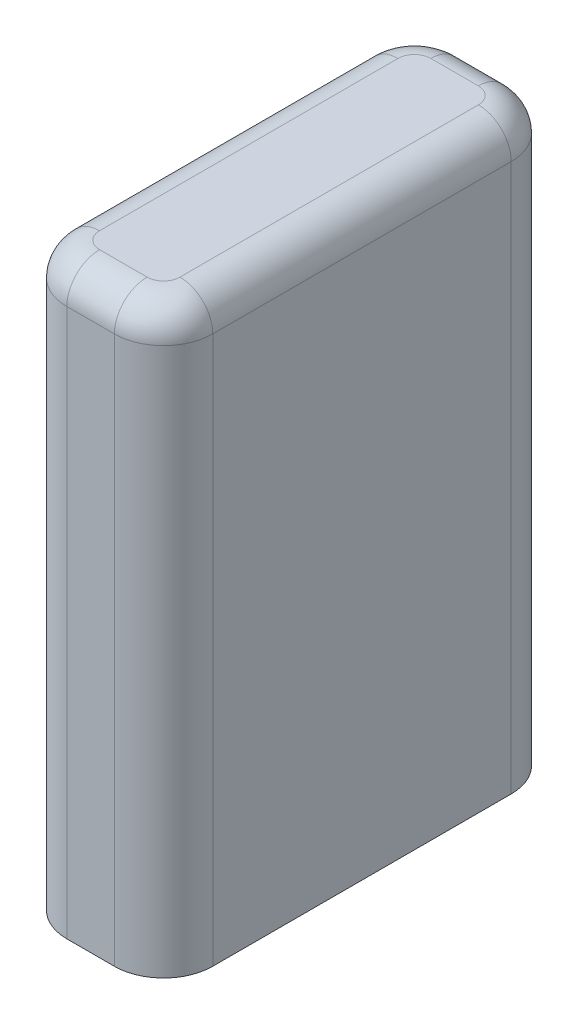
ISO-10303-21;
HEADER;
FILE_DESCRIPTION(('STEP AP214'),'2;1');
FILE_NAME('part.step','',(''),(''),'','','');
FILE_SCHEMA(('AUTOMOTIVE_DESIGN { 1 0 10303 214 1 1 1 1 }'));
ENDSEC;
DATA;
#1=APPLICATION_CONTEXT('core data for automotive mechanical design processes');
#2=APPLICATION_PROTOCOL_DEFINITION('international standard','automotive_design',2000,#1);
#3=PRODUCT_CONTEXT('',#1,'mechanical');
#4=PRODUCT('Part','Part','',(#3));
#5=PRODUCT_RELATED_PRODUCT_CATEGORY('part','',(#4));
#6=PRODUCT_DEFINITION_FORMATION('','',#4);
#7=PRODUCT_DEFINITION_CONTEXT('part definition',#1,'design');
#8=PRODUCT_DEFINITION('design','',#6,#7);
#9=PRODUCT_DEFINITION_SHAPE('','',#8);
#10=(LENGTH_UNIT() NAMED_UNIT(*) SI_UNIT(.MILLI.,.METRE.));
#11=(NAMED_UNIT(*) PLANE_ANGLE_UNIT() SI_UNIT($,.RADIAN.));
#12=(NAMED_UNIT(*) SI_UNIT($,.STERADIAN.) SOLID_ANGLE_UNIT());
#13=UNCERTAINTY_MEASURE_WITH_UNIT(LENGTH_MEASURE(1.E-05),#10,'distance_accuracy_value','');
#14=(GEOMETRIC_REPRESENTATION_CONTEXT(3) GLOBAL_UNCERTAINTY_ASSIGNED_CONTEXT((#13)) GLOBAL_UNIT_ASSIGNED_CONTEXT((#10,
#11,#12)) REPRESENTATION_CONTEXT('',''));
#15=CARTESIAN_POINT('',(0.,0.,0.));
#16=DIRECTION('',(0.,0.,1.));
#17=DIRECTION('',(1.,0.,0.));
#18=AXIS2_PLACEMENT_3D('',#15,#16,#17);
#19=CARTESIAN_POINT('',(1.96744186046514,35.4,8.16046511627906));
#20=DIRECTION('',(0.,-1.,0.));
#21=DIRECTION('',(0.,0.,-1.));
#22=AXIS2_PLACEMENT_3D('',#19,#20,#21);
#23=CYLINDRICAL_SURFACE('',#22,3.);
#24=DIRECTION('',(0.,-1.,0.));
#25=VECTOR('',#24,1.);
#26=CARTESIAN_POINT('',(4.96744186046514,35.4,8.16046511627904));
#27=LINE('',#26,#25);
#28=CARTESIAN_POINT('',(4.96744186046514,33.4,8.16046511627904));
#29=VERTEX_POINT('',#28);
#30=CARTESIAN_POINT('',(4.96744186046514,0.,8.16046511627904));
#31=VERTEX_POINT('',#30);
#32=EDGE_CURVE('E120',#29,#31,#27,.T.);
#33=ORIENTED_EDGE('',*,*,#32,.F.);
#34=CARTESIAN_POINT('',(1.96744186046514,33.4,8.16046511627906));
#35=DIRECTION('',(0.,-1.,0.));
#36=DIRECTION('',(0.,0.,-1.));
#37=AXIS2_PLACEMENT_3D('',#34,#35,#36);
#38=CIRCLE('',#37,3.);
#39=CARTESIAN_POINT('',(1.96744186046511,33.4,11.1604651162791));
#40=VERTEX_POINT('',#39);
#41=EDGE_CURVE('E11',#29,#40,#38,.T.);
#42=ORIENTED_EDGE('',*,*,#41,.T.);
#43=DIRECTION('',(0.,-1.,0.));
#44=VECTOR('',#43,1.);
#45=CARTESIAN_POINT('',(1.96744186046511,35.4,11.1604651162791));
#46=LINE('',#45,#44);
#47=CARTESIAN_POINT('',(1.96744186046511,0.,11.1604651162791));
#48=VERTEX_POINT('',#47);
#49=EDGE_CURVE('E142',#40,#48,#46,.T.);
#50=ORIENTED_EDGE('',*,*,#49,.T.);
#51=CARTESIAN_POINT('',(1.96744186046514,0.,8.16046511627906));
#52=DIRECTION('',(0.,1.,0.));
#53=DIRECTION('',(0.,0.,-1.));
#54=AXIS2_PLACEMENT_3D('',#51,#52,#53);
#55=CIRCLE('',#54,3.);
#56=EDGE_CURVE('E137',#48,#31,#55,.T.);
#57=ORIENTED_EDGE('',*,*,#56,.T.);
#58=EDGE_LOOP('',(#33,#42,#50,#57));
#59=FACE_BOUND('',#58,.T.);
#60=ADVANCED_FACE('F32',(#59),#23,.T.);
#61=CARTESIAN_POINT('',(4.96744186046513,35.4,-10.0395348837209));
#62=DIRECTION('',(-1.,0.,0.));
#63=DIRECTION('',(0.,0.,1.));
#64=AXIS2_PLACEMENT_3D('',#61,#62,#63);
#65=PLANE('',#64);
#66=DIRECTION('',(0.,-1.,0.));
#67=VECTOR('',#66,1.);
#68=CARTESIAN_POINT('',(4.96744186046513,35.4,-10.0395348837209));
#69=LINE('',#68,#67);
#70=CARTESIAN_POINT('',(4.96744186046513,33.4,-10.0395348837209));
#71=VERTEX_POINT('',#70);
#72=CARTESIAN_POINT('',(4.96744186046513,0.,-10.0395348837209));
#73=VERTEX_POINT('',#72);
#74=EDGE_CURVE('E131',#71,#73,#69,.T.);
#75=ORIENTED_EDGE('',*,*,#74,.F.);
#76=DIRECTION('',(0.,0.,-1.));
#77=VECTOR('',#76,1.);
#78=CARTESIAN_POINT('',(4.96744186046513,33.4,-10.0395348837209));
#79=LINE('',#78,#77);
#80=EDGE_CURVE('E127',#71,#29,#79,.F.);
#81=ORIENTED_EDGE('',*,*,#80,.T.);
#82=ORIENTED_EDGE('',*,*,#32,.T.);
#83=DIRECTION('',(0.,0.,-1.));
#84=VECTOR('',#83,1.);
#85=CARTESIAN_POINT('',(4.96744186046513,0.,-10.0395348837209));
#86=LINE('',#85,#84);
#87=EDGE_CURVE('E124',#31,#73,#86,.T.);
#88=ORIENTED_EDGE('',*,*,#87,.T.);
#89=EDGE_LOOP('',(#75,#81,#82,#88));
#90=FACE_BOUND('',#89,.T.);
#91=ADVANCED_FACE('F123',(#90),#65,.F.);
#92=CARTESIAN_POINT('',(1.96744186046513,35.4,-10.0395348837209));
#93=DIRECTION('',(0.,-1.,0.));
#94=DIRECTION('',(0.,0.,-1.));
#95=AXIS2_PLACEMENT_3D('',#92,#93,#94);
#96=CYLINDRICAL_SURFACE('',#95,3.);
#97=DIRECTION('',(0.,-1.,0.));
#98=VECTOR('',#97,1.);
#99=CARTESIAN_POINT('',(1.96744186046511,35.4,-13.0395348837209));
#100=LINE('',#99,#98);
#101=CARTESIAN_POINT('',(1.96744186046511,33.4,-13.0395348837209));
#102=VERTEX_POINT('',#101);
#103=CARTESIAN_POINT('',(1.96744186046511,0.,-13.0395348837209));
#104=VERTEX_POINT('',#103);
#105=EDGE_CURVE('E172',#102,#104,#100,.T.);
#106=ORIENTED_EDGE('',*,*,#105,.F.);
#107=CARTESIAN_POINT('',(1.96744186046513,33.4,-10.0395348837209));
#108=DIRECTION('',(0.,-1.,0.));
#109=DIRECTION('',(0.,0.,-1.));
#110=AXIS2_PLACEMENT_3D('',#107,#108,#109);
#111=CIRCLE('',#110,3.);
#112=EDGE_CURVE('E198',#102,#71,#111,.T.);
#113=ORIENTED_EDGE('',*,*,#112,.T.);
#114=ORIENTED_EDGE('',*,*,#74,.T.);
#115=CARTESIAN_POINT('',(1.96744186046513,0.,-10.0395348837209));
#116=DIRECTION('',(0.,1.,0.));
#117=DIRECTION('',(0.,0.,1.));
#118=AXIS2_PLACEMENT_3D('',#115,#116,#117);
#119=CIRCLE('',#118,3.);
#120=EDGE_CURVE('E140',#73,#104,#119,.T.);
#121=ORIENTED_EDGE('',*,*,#120,.T.);
#122=EDGE_LOOP('',(#106,#113,#114,#121));
#123=FACE_BOUND('',#122,.T.);
#124=ADVANCED_FACE('F273',(#123),#96,.T.);
#125=CARTESIAN_POINT('',(-0.932558139534845,35.4,-13.0395348837209));
#126=DIRECTION('',(0.,0.,1.));
#127=DIRECTION('',(1.,0.,0.));
#128=AXIS2_PLACEMENT_3D('',#125,#126,#127);
#129=PLANE('',#128);
#130=DIRECTION('',(0.,-1.,0.));
#131=VECTOR('',#130,1.);
#132=CARTESIAN_POINT('',(-0.932558139534845,35.4,-13.0395348837209));
#133=LINE('',#132,#131);
#134=CARTESIAN_POINT('',(-0.932558139534845,33.4,-13.0395348837209));
#135=VERTEX_POINT('',#134);
#136=CARTESIAN_POINT('',(-0.932558139534845,0.,-13.0395348837209));
#137=VERTEX_POINT('',#136);
#138=EDGE_CURVE('E170',#135,#137,#133,.T.);
#139=ORIENTED_EDGE('',*,*,#138,.F.);
#140=DIRECTION('',(-1.,0.,0.));
#141=VECTOR('',#140,1.);
#142=CARTESIAN_POINT('',(-0.932558139534845,33.4,-13.0395348837209));
#143=LINE('',#142,#141);
#144=EDGE_CURVE('E196',#135,#102,#143,.F.);
#145=ORIENTED_EDGE('',*,*,#144,.T.);
#146=ORIENTED_EDGE('',*,*,#105,.T.);
#147=DIRECTION('',(-1.,0.,0.));
#148=VECTOR('',#147,1.);
#149=CARTESIAN_POINT('',(-0.932558139534845,0.,-13.0395348837209));
#150=LINE('',#149,#148);
#151=EDGE_CURVE('E149',#104,#137,#150,.T.);
#152=ORIENTED_EDGE('',*,*,#151,.T.);
#153=EDGE_LOOP('',(#139,#145,#146,#152));
#154=FACE_BOUND('',#153,.T.);
#155=ADVANCED_FACE('F263',(#154),#129,.F.);
#156=CARTESIAN_POINT('',(-0.932558139534866,35.4,-10.0395348837209));
#157=DIRECTION('',(0.,-1.,0.));
#158=DIRECTION('',(0.,0.,-1.));
#159=AXIS2_PLACEMENT_3D('',#156,#157,#158);
#160=CYLINDRICAL_SURFACE('',#159,3.);
#161=DIRECTION('',(0.,-1.,0.));
#162=VECTOR('',#161,1.);
#163=CARTESIAN_POINT('',(-3.93255813953487,35.4,-10.0395348837209));
#164=LINE('',#163,#162);
#165=CARTESIAN_POINT('',(-3.93255813953487,33.4,-10.0395348837209));
#166=VERTEX_POINT('',#165);
#167=CARTESIAN_POINT('',(-3.93255813953487,0.,-10.0395348837209));
#168=VERTEX_POINT('',#167);
#169=EDGE_CURVE('E168',#166,#168,#164,.T.);
#170=ORIENTED_EDGE('',*,*,#169,.F.);
#171=CARTESIAN_POINT('',(-0.932558139534866,33.4,-10.0395348837209));
#172=DIRECTION('',(0.,-1.,0.));
#173=DIRECTION('',(0.,0.,-1.));
#174=AXIS2_PLACEMENT_3D('',#171,#172,#173);
#175=CIRCLE('',#174,3.);
#176=EDGE_CURVE('E194',#166,#135,#175,.T.);
#177=ORIENTED_EDGE('',*,*,#176,.T.);
#178=ORIENTED_EDGE('',*,*,#138,.T.);
#179=CARTESIAN_POINT('',(-0.932558139534866,0.,-10.0395348837209));
#180=DIRECTION('',(0.,1.,0.));
#181=DIRECTION('',(0.,0.,-1.));
#182=AXIS2_PLACEMENT_3D('',#179,#180,#181);
#183=CIRCLE('',#182,3.);
#184=EDGE_CURVE('E152',#137,#168,#183,.T.);
#185=ORIENTED_EDGE('',*,*,#184,.T.);
#186=EDGE_LOOP('',(#170,#177,#178,#185));
#187=FACE_BOUND('',#186,.T.);
#188=ADVANCED_FACE('F260',(#187),#160,.T.);
#189=CARTESIAN_POINT('',(-3.93255813953487,35.4,-10.0395348837209));
#190=DIRECTION('',(1.,0.,0.));
#191=DIRECTION('',(0.,0.,-1.));
#192=AXIS2_PLACEMENT_3D('',#189,#190,#191);
#193=PLANE('',#192);
#194=DIRECTION('',(0.,-1.,0.));
#195=VECTOR('',#194,1.);
#196=CARTESIAN_POINT('',(-3.93255813953486,35.4,8.16046511627904));
#197=LINE('',#196,#195);
#198=CARTESIAN_POINT('',(-3.93255813953486,33.4,8.16046511627904));
#199=VERTEX_POINT('',#198);
#200=CARTESIAN_POINT('',(-3.93255813953486,0.,8.16046511627904));
#201=VERTEX_POINT('',#200);
#202=EDGE_CURVE('E166',#199,#201,#197,.T.);
#203=ORIENTED_EDGE('',*,*,#202,.F.);
#204=DIRECTION('',(0.,0.,1.));
#205=VECTOR('',#204,1.);
#206=CARTESIAN_POINT('',(-3.93255813953487,33.4,-10.0395348837209));
#207=LINE('',#206,#205);
#208=EDGE_CURVE('E191',#199,#166,#207,.F.);
#209=ORIENTED_EDGE('',*,*,#208,.T.);
#210=ORIENTED_EDGE('',*,*,#169,.T.);
#211=DIRECTION('',(0.,0.,1.));
#212=VECTOR('',#211,1.);
#213=CARTESIAN_POINT('',(-3.93255813953487,0.,-10.0395348837209));
#214=LINE('',#213,#212);
#215=EDGE_CURVE('E155',#168,#201,#214,.T.);
#216=ORIENTED_EDGE('',*,*,#215,.T.);
#217=EDGE_LOOP('',(#203,#209,#210,#216));
#218=FACE_BOUND('',#217,.T.);
#219=ADVANCED_FACE('F245',(#218),#193,.F.);
#220=CARTESIAN_POINT('',(-0.932558139534864,35.4,8.16046511627906));
#221=DIRECTION('',(0.,-1.,0.));
#222=DIRECTION('',(0.,0.,-1.));
#223=AXIS2_PLACEMENT_3D('',#220,#221,#222);
#224=CYLINDRICAL_SURFACE('',#223,3.);
#225=DIRECTION('',(0.,-1.,0.));
#226=VECTOR('',#225,1.);
#227=CARTESIAN_POINT('',(-0.932558139534844,35.4,11.1604651162791));
#228=LINE('',#227,#226);
#229=CARTESIAN_POINT('',(-0.932558139534844,33.4,11.1604651162791));
#230=VERTEX_POINT('',#229);
#231=CARTESIAN_POINT('',(-0.932558139534844,0.,11.1604651162791));
#232=VERTEX_POINT('',#231);
#233=EDGE_CURVE('E164',#230,#232,#228,.T.);
#234=ORIENTED_EDGE('',*,*,#233,.F.);
#235=CARTESIAN_POINT('',(-0.932558139534864,33.4,8.16046511627906));
#236=DIRECTION('',(0.,-1.,0.));
#237=DIRECTION('',(0.,0.,-1.));
#238=AXIS2_PLACEMENT_3D('',#235,#236,#237);
#239=CIRCLE('',#238,3.);
#240=EDGE_CURVE('E201',#230,#199,#239,.T.);
#241=ORIENTED_EDGE('',*,*,#240,.T.);
#242=ORIENTED_EDGE('',*,*,#202,.T.);
#243=CARTESIAN_POINT('',(-0.932558139534864,0.,8.16046511627906));
#244=DIRECTION('',(0.,1.,0.));
#245=DIRECTION('',(0.,0.,-1.));
#246=AXIS2_PLACEMENT_3D('',#243,#244,#245);
#247=CIRCLE('',#246,3.);
#248=EDGE_CURVE('E158',#201,#232,#247,.T.);
#249=ORIENTED_EDGE('',*,*,#248,.T.);
#250=EDGE_LOOP('',(#234,#241,#242,#249));
#251=FACE_BOUND('',#250,.T.);
#252=ADVANCED_FACE('F242',(#251),#224,.T.);
#253=CARTESIAN_POINT('',(-0.932558139534843,35.4,11.1604651162791));
#254=DIRECTION('',(0.,0.,-1.));
#255=DIRECTION('',(-1.,0.,0.));
#256=AXIS2_PLACEMENT_3D('',#253,#254,#255);
#257=PLANE('',#256);
#258=ORIENTED_EDGE('',*,*,#49,.F.);
#259=DIRECTION('',(1.,0.,0.));
#260=VECTOR('',#259,1.);
#261=CARTESIAN_POINT('',(-0.932558139534843,33.4,11.1604651162791));
#262=LINE('',#261,#260);
#263=EDGE_CURVE('E41',#40,#230,#262,.F.);
#264=ORIENTED_EDGE('',*,*,#263,.T.);
#265=ORIENTED_EDGE('',*,*,#233,.T.);
#266=DIRECTION('',(1.,0.,0.));
#267=VECTOR('',#266,1.);
#268=CARTESIAN_POINT('',(-0.932558139534843,0.,11.1604651162791));
#269=LINE('',#268,#267);
#270=EDGE_CURVE('E161',#232,#48,#269,.T.);
#271=ORIENTED_EDGE('',*,*,#270,.T.);
#272=EDGE_LOOP('',(#258,#264,#265,#271));
#273=FACE_BOUND('',#272,.T.);
#274=ADVANCED_FACE('F274',(#273),#257,.F.);
#275=CARTESIAN_POINT('',(1.96744186046514,35.4,8.16046511627906));
#276=DIRECTION('',(0.,-1.,0.));
#277=DIRECTION('',(0.,0.,-1.));
#278=AXIS2_PLACEMENT_3D('',#275,#276,#277);
#279=PLANE('',#278);
#280=CARTESIAN_POINT('',(-0.932558139534866,35.4,-10.0395348837209));
#281=DIRECTION('',(0.,-1.,0.));
#282=DIRECTION('',(0.,0.,-1.));
#283=AXIS2_PLACEMENT_3D('',#280,#281,#282);
#284=CIRCLE('',#283,1.);
#285=CARTESIAN_POINT('',(-0.932558139534859,35.4,-11.0395348837209));
#286=VERTEX_POINT('',#285);
#287=CARTESIAN_POINT('',(-1.93255813953487,35.4,-10.0395348837209));
#288=VERTEX_POINT('',#287);
#289=EDGE_CURVE('E186',#286,#288,#284,.F.);
#290=ORIENTED_EDGE('',*,*,#289,.T.);
#291=DIRECTION('',(0.,0.,1.));
#292=VECTOR('',#291,1.);
#293=CARTESIAN_POINT('',(-1.93255813953486,35.4,8.16046511627906));
#294=LINE('',#293,#292);
#295=CARTESIAN_POINT('',(-1.93255813953486,35.4,8.16046511627904));
#296=VERTEX_POINT('',#295);
#297=EDGE_CURVE('E188',#288,#296,#294,.T.);
#298=ORIENTED_EDGE('',*,*,#297,.T.);
#299=CARTESIAN_POINT('',(-0.932558139534864,35.4,8.16046511627906));
#300=DIRECTION('',(0.,-1.,0.));
#301=DIRECTION('',(0.,0.,-1.));
#302=AXIS2_PLACEMENT_3D('',#299,#300,#301);
#303=CIRCLE('',#302,0.999999999999999);
#304=CARTESIAN_POINT('',(-0.932558139534857,35.4,9.16046511627906));
#305=VERTEX_POINT('',#304);
#306=EDGE_CURVE('E178',#296,#305,#303,.F.);
#307=ORIENTED_EDGE('',*,*,#306,.T.);
#308=DIRECTION('',(1.,0.,0.));
#309=VECTOR('',#308,1.);
#310=CARTESIAN_POINT('',(1.96744186046514,35.4,9.16046511627906));
#311=LINE('',#310,#309);
#312=CARTESIAN_POINT('',(1.96744186046511,35.4,9.16046511627906));
#313=VERTEX_POINT('',#312);
#314=EDGE_CURVE('E176',#305,#313,#311,.T.);
#315=ORIENTED_EDGE('',*,*,#314,.T.);
#316=CARTESIAN_POINT('',(1.96744186046514,35.4,8.16046511627906));
#317=DIRECTION('',(0.,-1.,0.));
#318=DIRECTION('',(0.,0.,-1.));
#319=AXIS2_PLACEMENT_3D('',#316,#317,#318);
#320=CIRCLE('',#319,1.);
#321=CARTESIAN_POINT('',(2.96744186046514,35.4,8.16046511627904));
#322=VERTEX_POINT('',#321);
#323=EDGE_CURVE('E130',#313,#322,#320,.F.);
#324=ORIENTED_EDGE('',*,*,#323,.T.);
#325=DIRECTION('',(0.,0.,-1.));
#326=VECTOR('',#325,1.);
#327=CARTESIAN_POINT('',(2.96744186046514,35.4,8.16046511627906));
#328=LINE('',#327,#326);
#329=CARTESIAN_POINT('',(2.96744186046513,35.4,-10.0395348837209));
#330=VERTEX_POINT('',#329);
#331=EDGE_CURVE('E180',#322,#330,#328,.T.);
#332=ORIENTED_EDGE('',*,*,#331,.T.);
#333=CARTESIAN_POINT('',(1.96744186046513,35.4,-10.0395348837209));
#334=DIRECTION('',(0.,-1.,0.));
#335=DIRECTION('',(0.,0.,-1.));
#336=AXIS2_PLACEMENT_3D('',#333,#334,#335);
#337=CIRCLE('',#336,1.);
#338=CARTESIAN_POINT('',(1.96744186046511,35.4,-11.0395348837209));
#339=VERTEX_POINT('',#338);
#340=EDGE_CURVE('E182',#330,#339,#337,.F.);
#341=ORIENTED_EDGE('',*,*,#340,.T.);
#342=DIRECTION('',(-1.,0.,0.));
#343=VECTOR('',#342,1.);
#344=CARTESIAN_POINT('',(1.96744186046514,35.4,-11.0395348837209));
#345=LINE('',#344,#343);
#346=EDGE_CURVE('E184',#339,#286,#345,.T.);
#347=ORIENTED_EDGE('',*,*,#346,.T.);
#348=EDGE_LOOP('',(#290,#298,#307,#315,#324,#332,#341,#347));
#349=FACE_BOUND('',#348,.T.);
#350=ADVANCED_FACE('F229',(#349),#279,.F.);
#351=CARTESIAN_POINT('',(1.96744186046514,0.,8.16046511627906));
#352=DIRECTION('',(0.,-1.,0.));
#353=DIRECTION('',(0.,0.,-1.));
#354=AXIS2_PLACEMENT_3D('',#351,#352,#353);
#355=PLANE('',#354);
#356=ORIENTED_EDGE('',*,*,#56,.F.);
#357=ORIENTED_EDGE('',*,*,#270,.F.);
#358=ORIENTED_EDGE('',*,*,#248,.F.);
#359=ORIENTED_EDGE('',*,*,#215,.F.);
#360=ORIENTED_EDGE('',*,*,#184,.F.);
#361=ORIENTED_EDGE('',*,*,#151,.F.);
#362=ORIENTED_EDGE('',*,*,#120,.F.);
#363=ORIENTED_EDGE('',*,*,#87,.F.);
#364=EDGE_LOOP('',(#356,#357,#358,#359,#360,#361,#362,#363));
#365=FACE_BOUND('',#364,.T.);
#366=ADVANCED_FACE('F135',(#365),#355,.T.);
#367=CARTESIAN_POINT('',(2.96744186046514,33.4,8.16046511627906));
#368=DIRECTION('',(0.,0.,-1.));
#369=DIRECTION('',(-1.,0.,0.));
#370=AXIS2_PLACEMENT_3D('',#367,#368,#369);
#371=CYLINDRICAL_SURFACE('',#370,2.);
#372=CARTESIAN_POINT('',(2.96744186046514,33.4,8.16046511627904));
#373=DIRECTION('',(0.,0.,1.));
#374=DIRECTION('',(1.,0.,0.));
#375=AXIS2_PLACEMENT_3D('',#372,#373,#374);
#376=CIRCLE('',#375,2.);
#377=EDGE_CURVE('E146',#29,#322,#376,.T.);
#378=ORIENTED_EDGE('',*,*,#377,.F.);
#379=ORIENTED_EDGE('',*,*,#80,.F.);
#380=CARTESIAN_POINT('',(2.96744186046513,33.4,-10.0395348837209));
#381=DIRECTION('',(0.,0.,-1.));
#382=DIRECTION('',(-1.,0.,0.));
#383=AXIS2_PLACEMENT_3D('',#380,#381,#382);
#384=CIRCLE('',#383,2.);
#385=EDGE_CURVE('E36',#330,#71,#384,.T.);
#386=ORIENTED_EDGE('',*,*,#385,.F.);
#387=ORIENTED_EDGE('',*,*,#331,.F.);
#388=EDGE_LOOP('',(#378,#379,#386,#387));
#389=FACE_BOUND('',#388,.T.);
#390=ADVANCED_FACE('F34',(#389),#371,.T.);
#391=CARTESIAN_POINT('',(1.96744186046513,33.4,-10.0395348837209));
#392=DIRECTION('',(0.,-1.,0.));
#393=DIRECTION('',(0.,0.,-1.));
#394=AXIS2_PLACEMENT_3D('',#391,#392,#393);
#395=DEGENERATE_TOROIDAL_SURFACE('',#394,1.,2.,.T.);
#396=ORIENTED_EDGE('',*,*,#385,.T.);
#397=ORIENTED_EDGE('',*,*,#112,.F.);
#398=CARTESIAN_POINT('',(1.96744186046511,33.4,-11.0395348837209));
#399=DIRECTION('',(-1.,0.,0.));
#400=DIRECTION('',(0.,0.,1.));
#401=AXIS2_PLACEMENT_3D('',#398,#399,#400);
#402=CIRCLE('',#401,2.);
#403=EDGE_CURVE('E217',#339,#102,#402,.T.);
#404=ORIENTED_EDGE('',*,*,#403,.F.);
#405=ORIENTED_EDGE('',*,*,#340,.F.);
#406=EDGE_LOOP('',(#396,#397,#404,#405));
#407=FACE_BOUND('',#406,.T.);
#408=ADVANCED_FACE('F271',(#407),#395,.T.);
#409=CARTESIAN_POINT('',(1.96744186046514,33.4,8.16046511627906));
#410=DIRECTION('',(0.,-1.,0.));
#411=DIRECTION('',(0.,0.,-1.));
#412=AXIS2_PLACEMENT_3D('',#409,#410,#411);
#413=DEGENERATE_TOROIDAL_SURFACE('',#412,1.,2.,.T.);
#414=ORIENTED_EDGE('',*,*,#377,.T.);
#415=ORIENTED_EDGE('',*,*,#323,.F.);
#416=CARTESIAN_POINT('',(1.96744186046513,33.4,9.16046511627906));
#417=DIRECTION('',(-1.,0.,0.));
#418=DIRECTION('',(0.,0.,1.));
#419=AXIS2_PLACEMENT_3D('',#416,#417,#418);
#420=CIRCLE('',#419,2.);
#421=EDGE_CURVE('E214',#40,#313,#420,.T.);
#422=ORIENTED_EDGE('',*,*,#421,.F.);
#423=ORIENTED_EDGE('',*,*,#41,.F.);
#424=EDGE_LOOP('',(#414,#415,#422,#423));
#425=FACE_BOUND('',#424,.T.);
#426=ADVANCED_FACE('F222',(#425),#413,.T.);
#427=CARTESIAN_POINT('',(1.96744186046514,33.4,-11.0395348837209));
#428=DIRECTION('',(-1.,0.,0.));
#429=DIRECTION('',(0.,0.,1.));
#430=AXIS2_PLACEMENT_3D('',#427,#428,#429);
#431=CYLINDRICAL_SURFACE('',#430,2.);
#432=ORIENTED_EDGE('',*,*,#403,.T.);
#433=ORIENTED_EDGE('',*,*,#144,.F.);
#434=CARTESIAN_POINT('',(-0.932558139534859,33.4,-11.0395348837209));
#435=DIRECTION('',(-1.,0.,0.));
#436=DIRECTION('',(0.,0.,1.));
#437=AXIS2_PLACEMENT_3D('',#434,#435,#436);
#438=CIRCLE('',#437,2.);
#439=EDGE_CURVE('E211',#286,#135,#438,.T.);
#440=ORIENTED_EDGE('',*,*,#439,.F.);
#441=ORIENTED_EDGE('',*,*,#346,.F.);
#442=EDGE_LOOP('',(#432,#433,#440,#441));
#443=FACE_BOUND('',#442,.T.);
#444=ADVANCED_FACE('F267',(#443),#431,.T.);
#445=CARTESIAN_POINT('',(1.96744186046514,33.4,9.16046511627906));
#446=DIRECTION('',(1.,0.,0.));
#447=DIRECTION('',(0.,0.,-1.));
#448=AXIS2_PLACEMENT_3D('',#445,#446,#447);
#449=CYLINDRICAL_SURFACE('',#448,2.);
#450=ORIENTED_EDGE('',*,*,#421,.T.);
#451=ORIENTED_EDGE('',*,*,#314,.F.);
#452=CARTESIAN_POINT('',(-0.932558139534844,33.4,9.16046511627906));
#453=DIRECTION('',(-1.,0.,0.));
#454=DIRECTION('',(0.,-1.,0.));
#455=AXIS2_PLACEMENT_3D('',#452,#453,#454);
#456=CIRCLE('',#455,2.);
#457=EDGE_CURVE('E208',#230,#305,#456,.T.);
#458=ORIENTED_EDGE('',*,*,#457,.F.);
#459=ORIENTED_EDGE('',*,*,#263,.F.);
#460=EDGE_LOOP('',(#450,#451,#458,#459));
#461=FACE_BOUND('',#460,.T.);
#462=ADVANCED_FACE('F235',(#461),#449,.T.);
#463=CARTESIAN_POINT('',(-0.932558139534866,33.4,-10.0395348837209));
#464=DIRECTION('',(0.,-1.,0.));
#465=DIRECTION('',(0.,0.,-1.));
#466=AXIS2_PLACEMENT_3D('',#463,#464,#465);
#467=DEGENERATE_TOROIDAL_SURFACE('',#466,1.,2.,.T.);
#468=ORIENTED_EDGE('',*,*,#439,.T.);
#469=ORIENTED_EDGE('',*,*,#176,.F.);
#470=CARTESIAN_POINT('',(-1.93255813953487,33.4,-10.0395348837209));
#471=DIRECTION('',(0.,0.,1.));
#472=DIRECTION('',(1.,0.,0.));
#473=AXIS2_PLACEMENT_3D('',#470,#471,#472);
#474=CIRCLE('',#473,2.);
#475=EDGE_CURVE('E206',#288,#166,#474,.T.);
#476=ORIENTED_EDGE('',*,*,#475,.F.);
#477=ORIENTED_EDGE('',*,*,#289,.F.);
#478=EDGE_LOOP('',(#468,#469,#476,#477));
#479=FACE_BOUND('',#478,.T.);
#480=ADVANCED_FACE('F256',(#479),#467,.T.);
#481=CARTESIAN_POINT('',(-0.932558139534864,33.4,8.16046511627906));
#482=DIRECTION('',(0.,-1.,0.));
#483=DIRECTION('',(0.,0.,-1.));
#484=AXIS2_PLACEMENT_3D('',#481,#482,#483);
#485=DEGENERATE_TOROIDAL_SURFACE('',#484,0.999999999999999,2.,.T.);
#486=ORIENTED_EDGE('',*,*,#457,.T.);
#487=ORIENTED_EDGE('',*,*,#306,.F.);
#488=CARTESIAN_POINT('',(-1.93255813953486,33.4,8.16046511627905));
#489=DIRECTION('',(0.,0.,-1.));
#490=DIRECTION('',(-1.,0.,0.));
#491=AXIS2_PLACEMENT_3D('',#488,#489,#490);
#492=CIRCLE('',#491,2.);
#493=EDGE_CURVE('E204',#199,#296,#492,.T.);
#494=ORIENTED_EDGE('',*,*,#493,.F.);
#495=ORIENTED_EDGE('',*,*,#240,.F.);
#496=EDGE_LOOP('',(#486,#487,#494,#495));
#497=FACE_BOUND('',#496,.T.);
#498=ADVANCED_FACE('F238',(#497),#485,.T.);
#499=CARTESIAN_POINT('',(-1.93255813953486,33.4,8.16046511627906));
#500=DIRECTION('',(0.,0.,1.));
#501=DIRECTION('',(1.,0.,0.));
#502=AXIS2_PLACEMENT_3D('',#499,#500,#501);
#503=CYLINDRICAL_SURFACE('',#502,2.);
#504=ORIENTED_EDGE('',*,*,#475,.T.);
#505=ORIENTED_EDGE('',*,*,#208,.F.);
#506=ORIENTED_EDGE('',*,*,#493,.T.);
#507=ORIENTED_EDGE('',*,*,#297,.F.);
#508=EDGE_LOOP('',(#504,#505,#506,#507));
#509=FACE_BOUND('',#508,.T.);
#510=ADVANCED_FACE('F250',(#509),#503,.T.);
#511=CLOSED_SHELL('',(#60,#91,#124,#155,#188,#219,#252,#274,#350,#366,#390,#408,#426,#444,#462,
#480,#498,#510));
#512=MANIFOLD_SOLID_BREP('B2',#511);
#513=ADVANCED_BREP_SHAPE_REPRESENTATION('',(#18,#512),#14);
#514=SHAPE_DEFINITION_REPRESENTATION(#9,#513);
ENDSEC;
END-ISO-10303-21;
